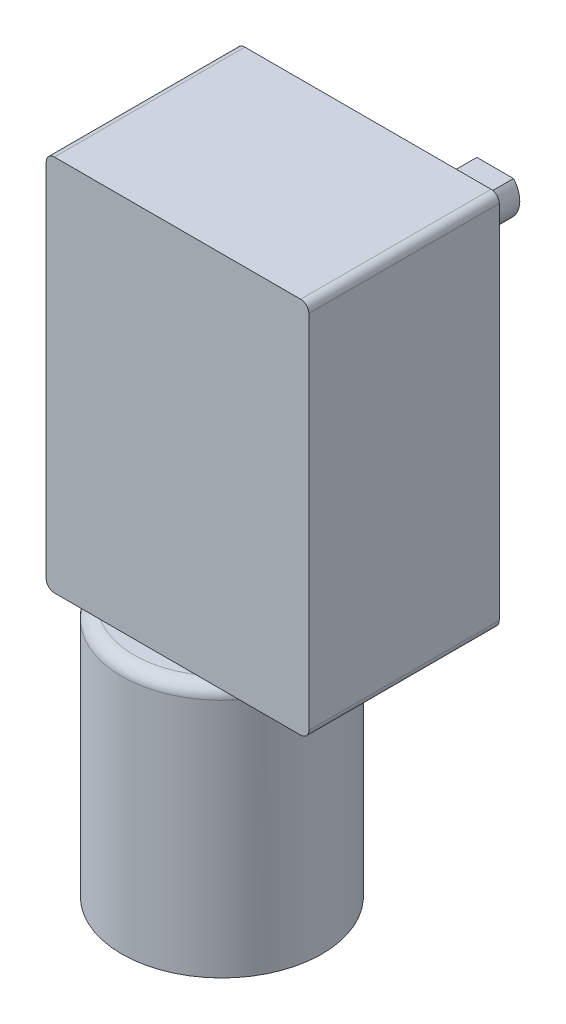
ISO-10303-21;
HEADER;
FILE_DESCRIPTION(('STEP AP214'),'2;1');
FILE_NAME('part.step','',(''),(''),'','','');
FILE_SCHEMA(('AUTOMOTIVE_DESIGN { 1 0 10303 214 1 1 1 1 }'));
ENDSEC;
DATA;
#1=APPLICATION_CONTEXT('core data for automotive mechanical design processes');
#2=APPLICATION_PROTOCOL_DEFINITION('international standard','automotive_design',2000,#1);
#3=PRODUCT_CONTEXT('',#1,'mechanical');
#4=PRODUCT('Part','Part','',(#3));
#5=PRODUCT_RELATED_PRODUCT_CATEGORY('part','',(#4));
#6=PRODUCT_DEFINITION_FORMATION('','',#4);
#7=PRODUCT_DEFINITION_CONTEXT('part definition',#1,'design');
#8=PRODUCT_DEFINITION('design','',#6,#7);
#9=PRODUCT_DEFINITION_SHAPE('','',#8);
#10=(LENGTH_UNIT() NAMED_UNIT(*) SI_UNIT(.MILLI.,.METRE.));
#11=(NAMED_UNIT(*) PLANE_ANGLE_UNIT() SI_UNIT($,.RADIAN.));
#12=(NAMED_UNIT(*) SI_UNIT($,.STERADIAN.) SOLID_ANGLE_UNIT());
#13=UNCERTAINTY_MEASURE_WITH_UNIT(LENGTH_MEASURE(1.E-05),#10,'distance_accuracy_value','');
#14=(GEOMETRIC_REPRESENTATION_CONTEXT(3) GLOBAL_UNCERTAINTY_ASSIGNED_CONTEXT((#13)) GLOBAL_UNIT_ASSIGNED_CONTEXT((#10,
#11,#12)) REPRESENTATION_CONTEXT('',''));
#15=CARTESIAN_POINT('',(0.,0.,0.));
#16=DIRECTION('',(0.,0.,1.));
#17=DIRECTION('',(1.,0.,0.));
#18=AXIS2_PLACEMENT_3D('',#15,#16,#17);
#19=CARTESIAN_POINT('',(12.2,-31.,14.));
#20=DIRECTION('',(0.,1.,0.));
#21=DIRECTION('',(0.,0.,1.));
#22=AXIS2_PLACEMENT_3D('',#19,#20,#21);
#23=CYLINDRICAL_SURFACE('',#22,12.2);
#24=CARTESIAN_POINT('',(12.2,-1.7,14.));
#25=DIRECTION('',(0.,-1.,0.));
#26=DIRECTION('',(0.,0.,-1.));
#27=AXIS2_PLACEMENT_3D('',#24,#25,#26);
#28=CIRCLE('',#27,12.2);
#29=CARTESIAN_POINT('',(12.2,-1.7,26.2));
#30=VERTEX_POINT('',#29);
#31=EDGE_CURVE('E65',#30,#30,#28,.T.);
#32=CARTESIAN_POINT('',(12.2,-31.,14.));
#33=DIRECTION('',(0.,-1.,0.));
#34=DIRECTION('',(0.,0.,-1.));
#35=AXIS2_PLACEMENT_3D('',#32,#33,#34);
#36=CIRCLE('',#35,12.2);
#37=CARTESIAN_POINT('',(12.2,-31.,26.2));
#38=VERTEX_POINT('',#37);
#39=EDGE_CURVE('E69',#38,#38,#36,.T.);
#40=CARTESIAN_POINT('',(12.2,-1.7,26.2));
#41=CARTESIAN_POINT('',(12.2,-2.00520833333333,26.2));
#42=CARTESIAN_POINT('',(12.2,-2.31041666666666,26.2));
#43=CARTESIAN_POINT('',(12.2,-2.92083333333333,26.2));
#44=CARTESIAN_POINT('',(12.2,-3.22604166666666,26.2));
#45=CARTESIAN_POINT('',(12.2,-3.83645833333333,26.2));
#46=CARTESIAN_POINT('',(12.2,-4.14166666666666,26.2));
#47=CARTESIAN_POINT('',(12.2,-4.75208333333333,26.2));
#48=CARTESIAN_POINT('',(12.2,-5.05729166666666,26.2));
#49=CARTESIAN_POINT('',(12.2,-5.66770833333333,26.2));
#50=CARTESIAN_POINT('',(12.2,-5.97291666666666,26.2));
#51=CARTESIAN_POINT('',(12.2,-6.58333333333333,26.2));
#52=CARTESIAN_POINT('',(12.2,-6.88854166666666,26.2));
#53=CARTESIAN_POINT('',(12.2,-7.49895833333333,26.2));
#54=CARTESIAN_POINT('',(12.2,-7.80416666666666,26.2));
#55=CARTESIAN_POINT('',(12.2,-8.41458333333333,26.2));
#56=CARTESIAN_POINT('',(12.2,-8.71979166666667,26.2));
#57=CARTESIAN_POINT('',(12.2,-9.33020833333333,26.2));
#58=CARTESIAN_POINT('',(12.2,-9.63541666666667,26.2));
#59=CARTESIAN_POINT('',(12.2,-10.2458333333333,26.2));
#60=CARTESIAN_POINT('',(12.2,-10.5510416666667,26.2));
#61=CARTESIAN_POINT('',(12.2,-11.1614583333333,26.2));
#62=CARTESIAN_POINT('',(12.2,-11.4666666666667,26.2));
#63=CARTESIAN_POINT('',(12.2,-12.0770833333333,26.2));
#64=CARTESIAN_POINT('',(12.2,-12.3822916666667,26.2));
#65=CARTESIAN_POINT('',(12.2,-12.9927083333333,26.2));
#66=CARTESIAN_POINT('',(12.2,-13.2979166666667,26.2));
#67=CARTESIAN_POINT('',(12.2,-13.9083333333333,26.2));
#68=CARTESIAN_POINT('',(12.2,-14.2135416666667,26.2));
#69=CARTESIAN_POINT('',(12.2,-14.8239583333333,26.2));
#70=CARTESIAN_POINT('',(12.2,-15.1291666666667,26.2));
#71=CARTESIAN_POINT('',(12.2,-15.7395833333333,26.2));
#72=CARTESIAN_POINT('',(12.2,-16.0447916666667,26.2));
#73=CARTESIAN_POINT('',(12.2,-16.6552083333333,26.2));
#74=CARTESIAN_POINT('',(12.2,-16.9604166666667,26.2));
#75=CARTESIAN_POINT('',(12.2,-17.5708333333333,26.2));
#76=CARTESIAN_POINT('',(12.2,-17.8760416666667,26.2));
#77=CARTESIAN_POINT('',(12.2,-18.4864583333333,26.2));
#78=CARTESIAN_POINT('',(12.2,-18.7916666666667,26.2));
#79=CARTESIAN_POINT('',(12.2,-19.4020833333333,26.2));
#80=CARTESIAN_POINT('',(12.2,-19.7072916666667,26.2));
#81=CARTESIAN_POINT('',(12.2,-20.3177083333333,26.2));
#82=CARTESIAN_POINT('',(12.2,-20.6229166666667,26.2));
#83=CARTESIAN_POINT('',(12.2,-21.2333333333333,26.2));
#84=CARTESIAN_POINT('',(12.2,-21.5385416666667,26.2));
#85=CARTESIAN_POINT('',(12.2,-22.1489583333333,26.2));
#86=CARTESIAN_POINT('',(12.2,-22.4541666666667,26.2));
#87=CARTESIAN_POINT('',(12.2,-23.0645833333333,26.2));
#88=CARTESIAN_POINT('',(12.2,-23.3697916666667,26.2));
#89=CARTESIAN_POINT('',(12.2,-23.9802083333333,26.2));
#90=CARTESIAN_POINT('',(12.2,-24.2854166666667,26.2));
#91=CARTESIAN_POINT('',(12.2,-24.8958333333333,26.2));
#92=CARTESIAN_POINT('',(12.2,-25.2010416666667,26.2));
#93=CARTESIAN_POINT('',(12.2,-25.8114583333333,26.2));
#94=CARTESIAN_POINT('',(12.2,-26.1166666666667,26.2));
#95=CARTESIAN_POINT('',(12.2,-26.7270833333333,26.2));
#96=CARTESIAN_POINT('',(12.2,-27.0322916666667,26.2));
#97=CARTESIAN_POINT('',(12.2,-27.6427083333333,26.2));
#98=CARTESIAN_POINT('',(12.2,-27.9479166666667,26.2));
#99=CARTESIAN_POINT('',(12.2,-28.5583333333333,26.2));
#100=CARTESIAN_POINT('',(12.2,-28.8635416666667,26.2));
#101=CARTESIAN_POINT('',(12.2,-29.4739583333333,26.2));
#102=CARTESIAN_POINT('',(12.2,-29.7791666666667,26.2));
#103=CARTESIAN_POINT('',(12.2,-30.3895833333333,26.2));
#104=CARTESIAN_POINT('',(12.2,-30.6947916666667,26.2));
#105=CARTESIAN_POINT('',(12.2,-31.,26.2));
#106=B_SPLINE_CURVE_WITH_KNOTS('',3,(#40,#41,#42,#43,#44,#45,#46,#47,#48,#49,#50,#51,#52,#53,
#54,#55,#56,#57,#58,#59,#60,#61,#62,#63,#64,#65,#66,#67,#68,#69,#70,#71,#72,#73,#74,#75,#76,#77,
#78,#79,#80,#81,#82,#83,#84,#85,#86,#87,#88,#89,#90,#91,#92,#93,#94,#95,#96,#97,#98,#99,#100,
#101,#102,#103,#104,#105),.UNSPECIFIED.,.F.,.F.,(4,2,2,2,2,2,2,2,2,2,2,2,2,2,2,2,2,2,2,2,2,2,2,
2,2,2,2,2,2,2,2,2,4),(0.,0.915625,1.83125,2.746875,3.6625,4.578125,5.49375,6.409375,7.325,
8.240625,9.15625,10.071875,10.9875,11.903125,12.81875,13.734375,14.65,15.565625,16.48125,
17.396875,18.3125,19.228125,20.14375,21.059375,21.975,22.890625,23.80625,24.721875,25.6375,
26.553125,27.46875,28.384375,29.3),.UNSPECIFIED.);
#107=EDGE_CURVE('BSEAM53',#30,#38,#106,.T.);
#108=ORIENTED_EDGE('',*,*,#31,.T.);
#109=ORIENTED_EDGE('',*,*,#39,.F.);
#110=ORIENTED_EDGE('',*,*,#107,.T.);
#111=ORIENTED_EDGE('',*,*,#107,.F.);
#112=EDGE_LOOP('',(#108,#110,#109,#111));
#113=FACE_BOUND('',#112,.T.);
#114=ADVANCED_FACE('F53',(#113),#23,.T.);
#115=CARTESIAN_POINT('',(12.2,-31.,14.));
#116=DIRECTION('',(0.,-1.,0.));
#117=DIRECTION('',(0.,0.,-1.));
#118=AXIS2_PLACEMENT_3D('',#115,#116,#117);
#119=PLANE('',#118);
#120=CARTESIAN_POINT('',(12.2,-31.,14.));
#121=DIRECTION('',(0.,-1.,0.));
#122=DIRECTION('',(0.,0.,-1.));
#123=AXIS2_PLACEMENT_3D('',#120,#121,#122);
#124=CIRCLE('',#123,3.25);
#125=CARTESIAN_POINT('',(12.2,-31.,10.75));
#126=VERTEX_POINT('',#125);
#127=EDGE_CURVE('E11',#126,#126,#124,.T.);
#128=ORIENTED_EDGE('',*,*,#127,.F.);
#129=EDGE_LOOP('',(#128));
#130=FACE_BOUND('',#129,.T.);
#131=ORIENTED_EDGE('',*,*,#39,.T.);
#132=EDGE_LOOP('',(#131));
#133=FACE_BOUND('',#132,.T.);
#134=ADVANCED_FACE('F87',(#130,#133),#119,.T.);
#135=CARTESIAN_POINT('',(12.2,-0.2,14.));
#136=DIRECTION('',(0.,-1.,0.));
#137=DIRECTION('',(0.,0.,-1.));
#138=AXIS2_PLACEMENT_3D('',#135,#136,#137);
#139=PLANE('',#138);
#140=CARTESIAN_POINT('',(12.2,-0.2,14.));
#141=DIRECTION('',(0.,-1.,0.));
#142=DIRECTION('',(0.,0.,-1.));
#143=AXIS2_PLACEMENT_3D('',#140,#141,#142);
#144=CIRCLE('',#143,10.7);
#145=CARTESIAN_POINT('',(12.2,-0.2,3.3));
#146=VERTEX_POINT('',#145);
#147=EDGE_CURVE('E57',#146,#146,#144,.F.);
#148=ORIENTED_EDGE('',*,*,#147,.T.);
#149=EDGE_LOOP('',(#148));
#150=FACE_BOUND('',#149,.T.);
#151=ADVANCED_FACE('F78',(#150),#139,.F.);
#152=CARTESIAN_POINT('',(12.2,-1.7,14.));
#153=DIRECTION('',(0.,-1.,0.));
#154=DIRECTION('',(0.,0.,-1.));
#155=AXIS2_PLACEMENT_3D('',#152,#153,#154);
#156=TOROIDAL_SURFACE('',#155,10.7,1.5);
#157=ORIENTED_EDGE('',*,*,#147,.F.);
#158=EDGE_LOOP('',(#157));
#159=FACE_BOUND('',#158,.T.);
#160=ORIENTED_EDGE('',*,*,#31,.F.);
#161=EDGE_LOOP('',(#160));
#162=FACE_BOUND('',#161,.T.);
#163=ADVANCED_FACE('F55',(#159,#162),#156,.T.);
#164=CARTESIAN_POINT('',(12.2,-33.,14.));
#165=DIRECTION('',(0.,1.,0.));
#166=DIRECTION('',(0.,0.,1.));
#167=AXIS2_PLACEMENT_3D('',#164,#165,#166);
#168=CYLINDRICAL_SURFACE('',#167,3.25);
#169=CARTESIAN_POINT('',(12.2,-33.,14.));
#170=DIRECTION('',(0.,-1.,0.));
#171=DIRECTION('',(0.,0.,-1.));
#172=AXIS2_PLACEMENT_3D('',#169,#170,#171);
#173=CIRCLE('',#172,3.25);
#174=CARTESIAN_POINT('',(12.2,-33.,10.75));
#175=VERTEX_POINT('',#174);
#176=EDGE_CURVE('E68',#175,#175,#173,.T.);
#177=ORIENTED_EDGE('',*,*,#176,.F.);
#178=EDGE_LOOP('',(#177));
#179=FACE_BOUND('',#178,.T.);
#180=ORIENTED_EDGE('',*,*,#127,.T.);
#181=EDGE_LOOP('',(#180));
#182=FACE_BOUND('',#181,.T.);
#183=ADVANCED_FACE('F77',(#179,#182),#168,.T.);
#184=CARTESIAN_POINT('',(12.2,-33.,14.));
#185=DIRECTION('',(0.,-1.,0.));
#186=DIRECTION('',(0.,0.,-1.));
#187=AXIS2_PLACEMENT_3D('',#184,#185,#186);
#188=PLANE('',#187);
#189=ORIENTED_EDGE('',*,*,#176,.T.);
#190=EDGE_LOOP('',(#189));
#191=FACE_BOUND('',#190,.T.);
#192=ADVANCED_FACE('F84',(#191),#188,.T.);
#193=CLOSED_SHELL('',(#114,#134,#151,#163,#183,#192));
#194=MANIFOLD_SOLID_BREP('B2',#193);
#195=CARTESIAN_POINT('',(0.,0.,23.2));
#196=DIRECTION('',(0.,1.,0.));
#197=DIRECTION('',(0.,0.,1.));
#198=AXIS2_PLACEMENT_3D('',#195,#196,#197);
#199=PLANE('',#198);
#200=DIRECTION('',(1.,0.,0.));
#201=VECTOR('',#200,1.);
#202=CARTESIAN_POINT('',(0.,0.,23.2));
#203=LINE('',#202,#201);
#204=CARTESIAN_POINT('',(1.,0.,23.2));
#205=VERTEX_POINT('',#204);
#206=CARTESIAN_POINT('',(31.,0.,23.2));
#207=VERTEX_POINT('',#206);
#208=EDGE_CURVE('E372',#205,#207,#203,.T.);
#209=ORIENTED_EDGE('',*,*,#208,.F.);
#210=DIRECTION('',(0.,0.,-1.));
#211=VECTOR('',#210,1.);
#212=CARTESIAN_POINT('',(1.,0.,0.));
#213=LINE('',#212,#211);
#214=CARTESIAN_POINT('',(1.,0.,0.));
#215=VERTEX_POINT('',#214);
#216=EDGE_CURVE('E447',#205,#215,#213,.T.);
#217=ORIENTED_EDGE('',*,*,#216,.T.);
#218=DIRECTION('',(1.,0.,0.));
#219=VECTOR('',#218,1.);
#220=CARTESIAN_POINT('',(0.,0.,0.));
#221=LINE('',#220,#219);
#222=CARTESIAN_POINT('',(31.,0.,0.));
#223=VERTEX_POINT('',#222);
#224=EDGE_CURVE('E368',#215,#223,#221,.T.);
#225=ORIENTED_EDGE('',*,*,#224,.T.);
#226=DIRECTION('',(0.,0.,-1.));
#227=VECTOR('',#226,1.);
#228=CARTESIAN_POINT('',(31.,0.,23.2));
#229=LINE('',#228,#227);
#230=EDGE_CURVE('E444',#223,#207,#229,.F.);
#231=ORIENTED_EDGE('',*,*,#230,.T.);
#232=EDGE_LOOP('',(#209,#217,#225,#231));
#233=FACE_BOUND('',#232,.T.);
#234=ADVANCED_FACE('F151',(#233),#199,.F.);
#235=CARTESIAN_POINT('',(32.,0.,23.2));
#236=DIRECTION('',(-1.,0.,0.));
#237=DIRECTION('',(0.,0.,1.));
#238=AXIS2_PLACEMENT_3D('',#235,#236,#237);
#239=PLANE('',#238);
#240=DIRECTION('',(0.,1.,0.));
#241=VECTOR('',#240,1.);
#242=CARTESIAN_POINT('',(32.,0.,0.));
#243=LINE('',#242,#241);
#244=CARTESIAN_POINT('',(32.,1.,0.));
#245=VERTEX_POINT('',#244);
#246=CARTESIAN_POINT('',(32.,45.,0.));
#247=VERTEX_POINT('',#246);
#248=EDGE_CURVE('E391',#245,#247,#243,.T.);
#249=ORIENTED_EDGE('',*,*,#248,.T.);
#250=DIRECTION('',(0.,0.,-1.));
#251=VECTOR('',#250,1.);
#252=CARTESIAN_POINT('',(32.,45.,23.2));
#253=LINE('',#252,#251);
#254=CARTESIAN_POINT('',(32.,45.,23.2));
#255=VERTEX_POINT('',#254);
#256=EDGE_CURVE('E51',#247,#255,#253,.F.);
#257=ORIENTED_EDGE('',*,*,#256,.T.);
#258=DIRECTION('',(0.,1.,0.));
#259=VECTOR('',#258,1.);
#260=CARTESIAN_POINT('',(32.,0.,23.2));
#261=LINE('',#260,#259);
#262=CARTESIAN_POINT('',(32.,1.,23.2));
#263=VERTEX_POINT('',#262);
#264=EDGE_CURVE('E375',#263,#255,#261,.T.);
#265=ORIENTED_EDGE('',*,*,#264,.F.);
#266=DIRECTION('',(0.,0.,-1.));
#267=VECTOR('',#266,1.);
#268=CARTESIAN_POINT('',(32.,1.,23.2));
#269=LINE('',#268,#267);
#270=EDGE_CURVE('E160',#263,#245,#269,.T.);
#271=ORIENTED_EDGE('',*,*,#270,.T.);
#272=EDGE_LOOP('',(#249,#257,#265,#271));
#273=FACE_BOUND('',#272,.T.);
#274=ADVANCED_FACE('F454',(#273),#239,.F.);
#275=CARTESIAN_POINT('',(0.,46.,23.2));
#276=DIRECTION('',(0.,1.,0.));
#277=DIRECTION('',(0.,0.,1.));
#278=AXIS2_PLACEMENT_3D('',#275,#276,#277);
#279=PLANE('',#278);
#280=DIRECTION('',(1.,0.,0.));
#281=VECTOR('',#280,1.);
#282=CARTESIAN_POINT('',(0.,46.,0.));
#283=LINE('',#282,#281);
#284=CARTESIAN_POINT('',(1.,46.,0.));
#285=VERTEX_POINT('',#284);
#286=CARTESIAN_POINT('',(31.,46.,0.));
#287=VERTEX_POINT('',#286);
#288=EDGE_CURVE('E394',#285,#287,#283,.T.);
#289=ORIENTED_EDGE('',*,*,#288,.F.);
#290=DIRECTION('',(0.,0.,-1.));
#291=VECTOR('',#290,1.);
#292=CARTESIAN_POINT('',(1.,46.,23.2));
#293=LINE('',#292,#291);
#294=CARTESIAN_POINT('',(1.,46.,23.2));
#295=VERTEX_POINT('',#294);
#296=EDGE_CURVE('E430',#285,#295,#293,.F.);
#297=ORIENTED_EDGE('',*,*,#296,.T.);
#298=DIRECTION('',(1.,0.,0.));
#299=VECTOR('',#298,1.);
#300=CARTESIAN_POINT('',(0.,46.,23.2));
#301=LINE('',#300,#299);
#302=CARTESIAN_POINT('',(31.,46.,23.2));
#303=VERTEX_POINT('',#302);
#304=EDGE_CURVE('E379',#295,#303,#301,.T.);
#305=ORIENTED_EDGE('',*,*,#304,.T.);
#306=DIRECTION('',(0.,0.,-1.));
#307=VECTOR('',#306,1.);
#308=CARTESIAN_POINT('',(31.,46.,0.));
#309=LINE('',#308,#307);
#310=EDGE_CURVE('E426',#303,#287,#309,.T.);
#311=ORIENTED_EDGE('',*,*,#310,.T.);
#312=EDGE_LOOP('',(#289,#297,#305,#311));
#313=FACE_BOUND('',#312,.T.);
#314=ADVANCED_FACE('F465',(#313),#279,.T.);
#315=CARTESIAN_POINT('',(0.,0.,23.2));
#316=DIRECTION('',(-1.,0.,0.));
#317=DIRECTION('',(0.,0.,1.));
#318=AXIS2_PLACEMENT_3D('',#315,#316,#317);
#319=PLANE('',#318);
#320=DIRECTION('',(0.,1.,0.));
#321=VECTOR('',#320,1.);
#322=CARTESIAN_POINT('',(0.,0.,23.2));
#323=LINE('',#322,#321);
#324=CARTESIAN_POINT('',(0.,1.,23.2));
#325=VERTEX_POINT('',#324);
#326=CARTESIAN_POINT('',(0.,45.,23.2));
#327=VERTEX_POINT('',#326);
#328=EDGE_CURVE('E383',#325,#327,#323,.T.);
#329=ORIENTED_EDGE('',*,*,#328,.T.);
#330=DIRECTION('',(0.,0.,-1.));
#331=VECTOR('',#330,1.);
#332=CARTESIAN_POINT('',(0.,45.,23.2));
#333=LINE('',#332,#331);
#334=CARTESIAN_POINT('',(0.,45.,0.));
#335=VERTEX_POINT('',#334);
#336=EDGE_CURVE('E410',#327,#335,#333,.T.);
#337=ORIENTED_EDGE('',*,*,#336,.T.);
#338=DIRECTION('',(0.,1.,0.));
#339=VECTOR('',#338,1.);
#340=CARTESIAN_POINT('',(0.,0.,0.));
#341=LINE('',#340,#339);
#342=CARTESIAN_POINT('',(0.,1.,0.));
#343=VERTEX_POINT('',#342);
#344=EDGE_CURVE('E376',#343,#335,#341,.T.);
#345=ORIENTED_EDGE('',*,*,#344,.F.);
#346=DIRECTION('',(0.,0.,-1.));
#347=VECTOR('',#346,1.);
#348=CARTESIAN_POINT('',(0.,1.,23.2));
#349=LINE('',#348,#347);
#350=EDGE_CURVE('E407',#343,#325,#349,.F.);
#351=ORIENTED_EDGE('',*,*,#350,.T.);
#352=EDGE_LOOP('',(#329,#337,#345,#351));
#353=FACE_BOUND('',#352,.T.);
#354=ADVANCED_FACE('F476',(#353),#319,.T.);
#355=CARTESIAN_POINT('',(0.,0.,23.2));
#356=DIRECTION('',(0.,0.,1.));
#357=DIRECTION('',(1.,0.,0.));
#358=AXIS2_PLACEMENT_3D('',#355,#356,#357);
#359=PLANE('',#358);
#360=ORIENTED_EDGE('',*,*,#304,.F.);
#361=CARTESIAN_POINT('',(1.,45.,23.2));
#362=DIRECTION('',(0.,0.,1.));
#363=DIRECTION('',(1.,0.,0.));
#364=AXIS2_PLACEMENT_3D('',#361,#362,#363);
#365=CIRCLE('',#364,1.);
#366=EDGE_CURVE('E441',#295,#327,#365,.T.);
#367=ORIENTED_EDGE('',*,*,#366,.T.);
#368=ORIENTED_EDGE('',*,*,#328,.F.);
#369=CARTESIAN_POINT('',(1.,1.,23.2));
#370=DIRECTION('',(0.,0.,1.));
#371=DIRECTION('',(1.,0.,0.));
#372=AXIS2_PLACEMENT_3D('',#369,#370,#371);
#373=CIRCLE('',#372,1.);
#374=EDGE_CURVE('E438',#325,#205,#373,.T.);
#375=ORIENTED_EDGE('',*,*,#374,.T.);
#376=ORIENTED_EDGE('',*,*,#208,.T.);
#377=CARTESIAN_POINT('',(31.,1.,23.2));
#378=DIRECTION('',(0.,0.,1.));
#379=DIRECTION('',(1.,0.,0.));
#380=AXIS2_PLACEMENT_3D('',#377,#378,#379);
#381=CIRCLE('',#380,1.);
#382=EDGE_CURVE('E172',#207,#263,#381,.T.);
#383=ORIENTED_EDGE('',*,*,#382,.T.);
#384=ORIENTED_EDGE('',*,*,#264,.T.);
#385=CARTESIAN_POINT('',(31.,45.,23.2));
#386=DIRECTION('',(0.,0.,1.));
#387=DIRECTION('',(1.,0.,0.));
#388=AXIS2_PLACEMENT_3D('',#385,#386,#387);
#389=CIRCLE('',#388,1.);
#390=EDGE_CURVE('E435',#255,#303,#389,.T.);
#391=ORIENTED_EDGE('',*,*,#390,.T.);
#392=EDGE_LOOP('',(#360,#367,#368,#375,#376,#383,#384,#391));
#393=FACE_BOUND('',#392,.T.);
#394=ADVANCED_FACE('F469',(#393),#359,.T.);
#395=CARTESIAN_POINT('',(0.,0.,0.));
#396=DIRECTION('',(0.,0.,1.));
#397=DIRECTION('',(1.,0.,0.));
#398=AXIS2_PLACEMENT_3D('',#395,#396,#397);
#399=PLANE('',#398);
#400=CARTESIAN_POINT('',(16.,31.,0.));
#401=DIRECTION('',(0.,0.,1.));
#402=DIRECTION('',(1.,0.,0.));
#403=AXIS2_PLACEMENT_3D('',#400,#401,#402);
#404=CIRCLE('',#403,7.);
#405=CARTESIAN_POINT('',(23.,31.,0.));
#406=VERTEX_POINT('',#405);
#407=EDGE_CURVE('E387',#406,#406,#404,.F.);
#408=ORIENTED_EDGE('',*,*,#407,.F.);
#409=EDGE_LOOP('',(#408));
#410=FACE_BOUND('',#409,.T.);
#411=CARTESIAN_POINT('',(25.,7.,0.));
#412=DIRECTION('',(0.,0.,1.));
#413=DIRECTION('',(1.,0.,0.));
#414=AXIS2_PLACEMENT_3D('',#411,#412,#413);
#415=CIRCLE('',#414,3.7);
#416=CARTESIAN_POINT('',(28.7,7.,0.));
#417=VERTEX_POINT('',#416);
#418=EDGE_CURVE('E339',#417,#417,#415,.T.);
#419=ORIENTED_EDGE('',*,*,#418,.T.);
#420=EDGE_LOOP('',(#419));
#421=FACE_BOUND('',#420,.T.);
#422=CARTESIAN_POINT('',(7.00000000000001,7.,0.));
#423=DIRECTION('',(0.,0.,1.));
#424=DIRECTION('',(1.,0.,0.));
#425=AXIS2_PLACEMENT_3D('',#422,#423,#424);
#426=CIRCLE('',#425,3.7);
#427=CARTESIAN_POINT('',(10.7,7.,0.));
#428=VERTEX_POINT('',#427);
#429=EDGE_CURVE('E344',#428,#428,#426,.T.);
#430=ORIENTED_EDGE('',*,*,#429,.T.);
#431=EDGE_LOOP('',(#430));
#432=FACE_BOUND('',#431,.T.);
#433=CARTESIAN_POINT('',(25.,40.,0.));
#434=DIRECTION('',(0.,0.,1.));
#435=DIRECTION('',(1.,0.,0.));
#436=AXIS2_PLACEMENT_3D('',#433,#434,#435);
#437=CIRCLE('',#436,3.7);
#438=CARTESIAN_POINT('',(28.7,40.,0.));
#439=VERTEX_POINT('',#438);
#440=EDGE_CURVE('E352',#439,#439,#437,.T.);
#441=ORIENTED_EDGE('',*,*,#440,.T.);
#442=EDGE_LOOP('',(#441));
#443=FACE_BOUND('',#442,.T.);
#444=CARTESIAN_POINT('',(7.00000000000001,40.,0.));
#445=DIRECTION('',(0.,0.,1.));
#446=DIRECTION('',(1.,0.,0.));
#447=AXIS2_PLACEMENT_3D('',#444,#445,#446);
#448=CIRCLE('',#447,3.7);
#449=CARTESIAN_POINT('',(10.7,40.,0.));
#450=VERTEX_POINT('',#449);
#451=EDGE_CURVE('E360',#450,#450,#448,.T.);
#452=ORIENTED_EDGE('',*,*,#451,.T.);
#453=EDGE_LOOP('',(#452));
#454=FACE_BOUND('',#453,.T.);
#455=ORIENTED_EDGE('',*,*,#344,.T.);
#456=CARTESIAN_POINT('',(1.,45.,0.));
#457=DIRECTION('',(0.,0.,1.));
#458=DIRECTION('',(1.,0.,0.));
#459=AXIS2_PLACEMENT_3D('',#456,#457,#458);
#460=CIRCLE('',#459,1.);
#461=EDGE_CURVE('E423',#335,#285,#460,.F.);
#462=ORIENTED_EDGE('',*,*,#461,.T.);
#463=ORIENTED_EDGE('',*,*,#288,.T.);
#464=CARTESIAN_POINT('',(31.,45.,0.));
#465=DIRECTION('',(0.,0.,1.));
#466=DIRECTION('',(1.,0.,0.));
#467=AXIS2_PLACEMENT_3D('',#464,#465,#466);
#468=CIRCLE('',#467,1.);
#469=EDGE_CURVE('E417',#287,#247,#468,.F.);
#470=ORIENTED_EDGE('',*,*,#469,.T.);
#471=ORIENTED_EDGE('',*,*,#248,.F.);
#472=CARTESIAN_POINT('',(31.,1.,0.));
#473=DIRECTION('',(0.,0.,1.));
#474=DIRECTION('',(1.,0.,0.));
#475=AXIS2_PLACEMENT_3D('',#472,#473,#474);
#476=CIRCLE('',#475,1.);
#477=EDGE_CURVE('E414',#245,#223,#476,.F.);
#478=ORIENTED_EDGE('',*,*,#477,.T.);
#479=ORIENTED_EDGE('',*,*,#224,.F.);
#480=CARTESIAN_POINT('',(1.,1.,0.));
#481=DIRECTION('',(0.,0.,1.));
#482=DIRECTION('',(1.,0.,0.));
#483=AXIS2_PLACEMENT_3D('',#480,#481,#482);
#484=CIRCLE('',#483,1.);
#485=EDGE_CURVE('E420',#215,#343,#484,.F.);
#486=ORIENTED_EDGE('',*,*,#485,.T.);
#487=EDGE_LOOP('',(#455,#462,#463,#470,#471,#478,#479,#486));
#488=FACE_BOUND('',#487,.T.);
#489=ADVANCED_FACE('F457',(#410,#421,#432,#443,#454,#488),#399,.F.);
#490=CARTESIAN_POINT('',(7.00000000000001,40.,-2.));
#491=DIRECTION('',(0.,0.,1.));
#492=DIRECTION('',(1.,0.,0.));
#493=AXIS2_PLACEMENT_3D('',#490,#491,#492);
#494=CYLINDRICAL_SURFACE('',#493,3.7);
#495=CARTESIAN_POINT('',(7.00000000000001,40.,-2.));
#496=DIRECTION('',(0.,0.,1.));
#497=DIRECTION('',(1.,0.,0.));
#498=AXIS2_PLACEMENT_3D('',#495,#496,#497);
#499=CIRCLE('',#498,3.7);
#500=CARTESIAN_POINT('',(10.7,40.,-2.));
#501=VERTEX_POINT('',#500);
#502=EDGE_CURVE('E364',#501,#501,#499,.T.);
#503=ORIENTED_EDGE('',*,*,#502,.T.);
#504=EDGE_LOOP('',(#503));
#505=FACE_BOUND('',#504,.T.);
#506=ORIENTED_EDGE('',*,*,#451,.F.);
#507=EDGE_LOOP('',(#506));
#508=FACE_BOUND('',#507,.T.);
#509=ADVANCED_FACE('F543',(#505,#508),#494,.T.);
#510=CARTESIAN_POINT('',(0.,0.,-2.));
#511=DIRECTION('',(0.,0.,1.));
#512=DIRECTION('',(1.,0.,0.));
#513=AXIS2_PLACEMENT_3D('',#510,#511,#512);
#514=PLANE('',#513);
#515=CARTESIAN_POINT('',(7.00000000000001,40.,-2.));
#516=DIRECTION('',(0.,0.,-1.));
#517=DIRECTION('',(-1.,0.,0.));
#518=AXIS2_PLACEMENT_3D('',#515,#516,#517);
#519=CIRCLE('',#518,1.525);
#520=CARTESIAN_POINT('',(5.47500000000001,40.,-2.));
#521=VERTEX_POINT('',#520);
#522=EDGE_CURVE('E327',#521,#521,#519,.T.);
#523=ORIENTED_EDGE('',*,*,#522,.F.);
#524=EDGE_LOOP('',(#523));
#525=FACE_BOUND('',#524,.T.);
#526=ORIENTED_EDGE('',*,*,#502,.F.);
#527=EDGE_LOOP('',(#526));
#528=FACE_BOUND('',#527,.T.);
#529=ADVANCED_FACE('F840',(#525,#528),#514,.F.);
#530=CARTESIAN_POINT('',(25.,40.,-2.));
#531=DIRECTION('',(0.,0.,1.));
#532=DIRECTION('',(1.,0.,0.));
#533=AXIS2_PLACEMENT_3D('',#530,#531,#532);
#534=CYLINDRICAL_SURFACE('',#533,3.7);
#535=CARTESIAN_POINT('',(25.,40.,-2.));
#536=DIRECTION('',(0.,0.,1.));
#537=DIRECTION('',(1.,0.,0.));
#538=AXIS2_PLACEMENT_3D('',#535,#536,#537);
#539=CIRCLE('',#538,3.7);
#540=CARTESIAN_POINT('',(28.7,40.,-2.));
#541=VERTEX_POINT('',#540);
#542=EDGE_CURVE('E356',#541,#541,#539,.T.);
#543=ORIENTED_EDGE('',*,*,#542,.T.);
#544=EDGE_LOOP('',(#543));
#545=FACE_BOUND('',#544,.T.);
#546=ORIENTED_EDGE('',*,*,#440,.F.);
#547=EDGE_LOOP('',(#546));
#548=FACE_BOUND('',#547,.T.);
#549=ADVANCED_FACE('F831',(#545,#548),#534,.T.);
#550=CARTESIAN_POINT('',(0.,0.,-2.));
#551=DIRECTION('',(0.,0.,1.));
#552=DIRECTION('',(1.,0.,0.));
#553=AXIS2_PLACEMENT_3D('',#550,#551,#552);
#554=PLANE('',#553);
#555=CARTESIAN_POINT('',(25.,40.,-2.));
#556=DIRECTION('',(0.,0.,-1.));
#557=DIRECTION('',(-1.,0.,0.));
#558=AXIS2_PLACEMENT_3D('',#555,#556,#557);
#559=CIRCLE('',#558,1.525);
#560=CARTESIAN_POINT('',(23.475,40.,-2.));
#561=VERTEX_POINT('',#560);
#562=EDGE_CURVE('E315',#561,#561,#559,.T.);
#563=ORIENTED_EDGE('',*,*,#562,.F.);
#564=EDGE_LOOP('',(#563));
#565=FACE_BOUND('',#564,.T.);
#566=ORIENTED_EDGE('',*,*,#542,.F.);
#567=EDGE_LOOP('',(#566));
#568=FACE_BOUND('',#567,.T.);
#569=ADVANCED_FACE('F825',(#565,#568),#554,.F.);
#570=CARTESIAN_POINT('',(7.00000000000001,7.,-2.));
#571=DIRECTION('',(0.,0.,1.));
#572=DIRECTION('',(1.,0.,0.));
#573=AXIS2_PLACEMENT_3D('',#570,#571,#572);
#574=CYLINDRICAL_SURFACE('',#573,3.7);
#575=CARTESIAN_POINT('',(7.00000000000001,7.,-2.));
#576=DIRECTION('',(0.,0.,1.));
#577=DIRECTION('',(1.,0.,0.));
#578=AXIS2_PLACEMENT_3D('',#575,#576,#577);
#579=CIRCLE('',#578,3.7);
#580=CARTESIAN_POINT('',(10.7,7.,-2.));
#581=VERTEX_POINT('',#580);
#582=EDGE_CURVE('E348',#581,#581,#579,.T.);
#583=ORIENTED_EDGE('',*,*,#582,.T.);
#584=EDGE_LOOP('',(#583));
#585=FACE_BOUND('',#584,.T.);
#586=ORIENTED_EDGE('',*,*,#429,.F.);
#587=EDGE_LOOP('',(#586));
#588=FACE_BOUND('',#587,.T.);
#589=ADVANCED_FACE('F818',(#585,#588),#574,.T.);
#590=CARTESIAN_POINT('',(0.,0.,-2.));
#591=DIRECTION('',(0.,0.,1.));
#592=DIRECTION('',(1.,0.,0.));
#593=AXIS2_PLACEMENT_3D('',#590,#591,#592);
#594=PLANE('',#593);
#595=CARTESIAN_POINT('',(7.00000000000001,7.,-2.));
#596=DIRECTION('',(0.,0.,-1.));
#597=DIRECTION('',(-1.,0.,0.));
#598=AXIS2_PLACEMENT_3D('',#595,#596,#597);
#599=CIRCLE('',#598,1.525);
#600=CARTESIAN_POINT('',(5.47500000000001,7.,-2.));
#601=VERTEX_POINT('',#600);
#602=EDGE_CURVE('E291',#601,#601,#599,.T.);
#603=ORIENTED_EDGE('',*,*,#602,.F.);
#604=EDGE_LOOP('',(#603));
#605=FACE_BOUND('',#604,.T.);
#606=ORIENTED_EDGE('',*,*,#582,.F.);
#607=EDGE_LOOP('',(#606));
#608=FACE_BOUND('',#607,.T.);
#609=ADVANCED_FACE('F813',(#605,#608),#594,.F.);
#610=CARTESIAN_POINT('',(25.,7.,-2.));
#611=DIRECTION('',(0.,0.,1.));
#612=DIRECTION('',(1.,0.,0.));
#613=AXIS2_PLACEMENT_3D('',#610,#611,#612);
#614=CYLINDRICAL_SURFACE('',#613,3.7);
#615=CARTESIAN_POINT('',(25.,7.,-2.));
#616=DIRECTION('',(0.,0.,1.));
#617=DIRECTION('',(1.,0.,0.));
#618=AXIS2_PLACEMENT_3D('',#615,#616,#617);
#619=CIRCLE('',#618,3.7);
#620=CARTESIAN_POINT('',(28.7,7.,-2.));
#621=VERTEX_POINT('',#620);
#622=EDGE_CURVE('E340',#621,#621,#619,.T.);
#623=ORIENTED_EDGE('',*,*,#622,.T.);
#624=EDGE_LOOP('',(#623));
#625=FACE_BOUND('',#624,.T.);
#626=ORIENTED_EDGE('',*,*,#418,.F.);
#627=EDGE_LOOP('',(#626));
#628=FACE_BOUND('',#627,.T.);
#629=ADVANCED_FACE('F804',(#625,#628),#614,.T.);
#630=CARTESIAN_POINT('',(0.,0.,-2.));
#631=DIRECTION('',(0.,0.,1.));
#632=DIRECTION('',(1.,0.,0.));
#633=AXIS2_PLACEMENT_3D('',#630,#631,#632);
#634=PLANE('',#633);
#635=CARTESIAN_POINT('',(25.,7.,-2.));
#636=DIRECTION('',(0.,0.,-1.));
#637=DIRECTION('',(-1.,0.,0.));
#638=AXIS2_PLACEMENT_3D('',#635,#636,#637);
#639=CIRCLE('',#638,1.525);
#640=CARTESIAN_POINT('',(23.475,7.,-2.));
#641=VERTEX_POINT('',#640);
#642=EDGE_CURVE('E303',#641,#641,#639,.T.);
#643=ORIENTED_EDGE('',*,*,#642,.F.);
#644=EDGE_LOOP('',(#643));
#645=FACE_BOUND('',#644,.T.);
#646=ORIENTED_EDGE('',*,*,#622,.F.);
#647=EDGE_LOOP('',(#646));
#648=FACE_BOUND('',#647,.T.);
#649=ADVANCED_FACE('F793',(#645,#648),#634,.F.);
#650=CARTESIAN_POINT('',(7.00000000000001,40.,5.49999999999999));
#651=DIRECTION('',(0.,0.,-1.));
#652=DIRECTION('',(-1.,0.,0.));
#653=AXIS2_PLACEMENT_3D('',#650,#651,#652);
#654=CONICAL_SURFACE('',#653,1.24999999999999,1.02974425867665);
#655=CARTESIAN_POINT('',(7.,40.,6.25107577378444));
#656=VERTEX_POINT('',#655);
#657=VERTEX_LOOP('',#656);
#658=FACE_BOUND('',#657,.T.);
#659=CARTESIAN_POINT('',(7.00000000000001,40.,5.49999999999999));
#660=DIRECTION('',(0.,0.,-1.));
#661=DIRECTION('',(-1.,0.,0.));
#662=AXIS2_PLACEMENT_3D('',#659,#660,#661);
#663=CIRCLE('',#662,1.24999999999999);
#664=CARTESIAN_POINT('',(5.75000000000002,40.,5.49999999999999));
#665=VERTEX_POINT('',#664);
#666=EDGE_CURVE('E335',#665,#665,#663,.T.);
#667=ORIENTED_EDGE('',*,*,#666,.T.);
#668=EDGE_LOOP('',(#667));
#669=FACE_BOUND('',#668,.T.);
#670=ADVANCED_FACE('F783',(#658,#669),#654,.F.);
#671=CARTESIAN_POINT('',(7.00000000000001,40.,-2.));
#672=DIRECTION('',(0.,0.,-1.));
#673=DIRECTION('',(-1.,0.,0.));
#674=AXIS2_PLACEMENT_3D('',#671,#672,#673);
#675=CYLINDRICAL_SURFACE('',#674,1.24999999999999);
#676=ORIENTED_EDGE('',*,*,#666,.F.);
#677=EDGE_LOOP('',(#676));
#678=FACE_BOUND('',#677,.T.);
#679=CARTESIAN_POINT('',(7.00000000000001,40.,-1.725));
#680=DIRECTION('',(0.,0.,-1.));
#681=DIRECTION('',(-1.,0.,0.));
#682=AXIS2_PLACEMENT_3D('',#679,#680,#681);
#683=CIRCLE('',#682,1.25);
#684=CARTESIAN_POINT('',(5.75000000000001,40.,-1.725));
#685=VERTEX_POINT('',#684);
#686=EDGE_CURVE('E331',#685,#685,#683,.T.);
#687=ORIENTED_EDGE('',*,*,#686,.T.);
#688=EDGE_LOOP('',(#687));
#689=FACE_BOUND('',#688,.T.);
#690=ADVANCED_FACE('F773',(#678,#689),#675,.F.);
#691=CARTESIAN_POINT('',(7.00000000000001,40.,-2.));
#692=DIRECTION('',(0.,0.,-1.));
#693=DIRECTION('',(-1.,0.,0.));
#694=AXIS2_PLACEMENT_3D('',#691,#692,#693);
#695=CONICAL_SURFACE('',#694,1.525,0.785398163397445);
#696=ORIENTED_EDGE('',*,*,#686,.F.);
#697=EDGE_LOOP('',(#696));
#698=FACE_BOUND('',#697,.T.);
#699=ORIENTED_EDGE('',*,*,#522,.T.);
#700=EDGE_LOOP('',(#699));
#701=FACE_BOUND('',#700,.T.);
#702=ADVANCED_FACE('F763',(#698,#701),#695,.F.);
#703=CARTESIAN_POINT('',(25.,40.,5.49999999999999));
#704=DIRECTION('',(0.,0.,-1.));
#705=DIRECTION('',(-1.,0.,0.));
#706=AXIS2_PLACEMENT_3D('',#703,#704,#705);
#707=CONICAL_SURFACE('',#706,1.24999999999999,1.02974425867665);
#708=CARTESIAN_POINT('',(25.,40.,6.25107577378444));
#709=VERTEX_POINT('',#708);
#710=VERTEX_LOOP('',#709);
#711=FACE_BOUND('',#710,.T.);
#712=CARTESIAN_POINT('',(25.,40.,5.49999999999999));
#713=DIRECTION('',(0.,0.,-1.));
#714=DIRECTION('',(-1.,0.,0.));
#715=AXIS2_PLACEMENT_3D('',#712,#713,#714);
#716=CIRCLE('',#715,1.24999999999999);
#717=CARTESIAN_POINT('',(23.75,40.,5.49999999999999));
#718=VERTEX_POINT('',#717);
#719=EDGE_CURVE('E323',#718,#718,#716,.T.);
#720=ORIENTED_EDGE('',*,*,#719,.T.);
#721=EDGE_LOOP('',(#720));
#722=FACE_BOUND('',#721,.T.);
#723=ADVANCED_FACE('F753',(#711,#722),#707,.F.);
#724=CARTESIAN_POINT('',(25.,40.,-2.));
#725=DIRECTION('',(0.,0.,-1.));
#726=DIRECTION('',(-1.,0.,0.));
#727=AXIS2_PLACEMENT_3D('',#724,#725,#726);
#728=CYLINDRICAL_SURFACE('',#727,1.24999999999999);
#729=ORIENTED_EDGE('',*,*,#719,.F.);
#730=EDGE_LOOP('',(#729));
#731=FACE_BOUND('',#730,.T.);
#732=CARTESIAN_POINT('',(25.,40.,-1.725));
#733=DIRECTION('',(0.,0.,-1.));
#734=DIRECTION('',(-1.,0.,0.));
#735=AXIS2_PLACEMENT_3D('',#732,#733,#734);
#736=CIRCLE('',#735,1.25);
#737=CARTESIAN_POINT('',(23.75,40.,-1.725));
#738=VERTEX_POINT('',#737);
#739=EDGE_CURVE('E319',#738,#738,#736,.T.);
#740=ORIENTED_EDGE('',*,*,#739,.T.);
#741=EDGE_LOOP('',(#740));
#742=FACE_BOUND('',#741,.T.);
#743=ADVANCED_FACE('F743',(#731,#742),#728,.F.);
#744=CARTESIAN_POINT('',(25.,40.,-2.));
#745=DIRECTION('',(0.,0.,-1.));
#746=DIRECTION('',(-1.,0.,0.));
#747=AXIS2_PLACEMENT_3D('',#744,#745,#746);
#748=CONICAL_SURFACE('',#747,1.525,0.785398163397451);
#749=ORIENTED_EDGE('',*,*,#739,.F.);
#750=EDGE_LOOP('',(#749));
#751=FACE_BOUND('',#750,.T.);
#752=ORIENTED_EDGE('',*,*,#562,.T.);
#753=EDGE_LOOP('',(#752));
#754=FACE_BOUND('',#753,.T.);
#755=ADVANCED_FACE('F733',(#751,#754),#748,.F.);
#756=CARTESIAN_POINT('',(25.,7.,5.49999999999999));
#757=DIRECTION('',(0.,0.,-1.));
#758=DIRECTION('',(-1.,0.,0.));
#759=AXIS2_PLACEMENT_3D('',#756,#757,#758);
#760=CONICAL_SURFACE('',#759,1.24999999999999,1.02974425867665);
#761=CARTESIAN_POINT('',(25.,7.,6.25107577378444));
#762=VERTEX_POINT('',#761);
#763=VERTEX_LOOP('',#762);
#764=FACE_BOUND('',#763,.T.);
#765=CARTESIAN_POINT('',(25.,7.,5.49999999999999));
#766=DIRECTION('',(0.,0.,-1.));
#767=DIRECTION('',(-1.,0.,0.));
#768=AXIS2_PLACEMENT_3D('',#765,#766,#767);
#769=CIRCLE('',#768,1.24999999999999);
#770=CARTESIAN_POINT('',(23.75,7.,5.49999999999999));
#771=VERTEX_POINT('',#770);
#772=EDGE_CURVE('E311',#771,#771,#769,.T.);
#773=ORIENTED_EDGE('',*,*,#772,.T.);
#774=EDGE_LOOP('',(#773));
#775=FACE_BOUND('',#774,.T.);
#776=ADVANCED_FACE('F722',(#764,#775),#760,.F.);
#777=CARTESIAN_POINT('',(25.,7.,-2.));
#778=DIRECTION('',(0.,0.,-1.));
#779=DIRECTION('',(-1.,0.,0.));
#780=AXIS2_PLACEMENT_3D('',#777,#778,#779);
#781=CYLINDRICAL_SURFACE('',#780,1.24999999999999);
#782=ORIENTED_EDGE('',*,*,#772,.F.);
#783=EDGE_LOOP('',(#782));
#784=FACE_BOUND('',#783,.T.);
#785=CARTESIAN_POINT('',(25.,7.,-1.725));
#786=DIRECTION('',(0.,0.,-1.));
#787=DIRECTION('',(-1.,0.,0.));
#788=AXIS2_PLACEMENT_3D('',#785,#786,#787);
#789=CIRCLE('',#788,1.25);
#790=CARTESIAN_POINT('',(23.75,7.,-1.725));
#791=VERTEX_POINT('',#790);
#792=EDGE_CURVE('E307',#791,#791,#789,.T.);
#793=ORIENTED_EDGE('',*,*,#792,.T.);
#794=EDGE_LOOP('',(#793));
#795=FACE_BOUND('',#794,.T.);
#796=ADVANCED_FACE('F712',(#784,#795),#781,.F.);
#797=CARTESIAN_POINT('',(25.,7.,-2.));
#798=DIRECTION('',(0.,0.,-1.));
#799=DIRECTION('',(-1.,0.,0.));
#800=AXIS2_PLACEMENT_3D('',#797,#798,#799);
#801=CONICAL_SURFACE('',#800,1.525,0.785398163397451);
#802=ORIENTED_EDGE('',*,*,#792,.F.);
#803=EDGE_LOOP('',(#802));
#804=FACE_BOUND('',#803,.T.);
#805=ORIENTED_EDGE('',*,*,#642,.T.);
#806=EDGE_LOOP('',(#805));
#807=FACE_BOUND('',#806,.T.);
#808=ADVANCED_FACE('F702',(#804,#807),#801,.F.);
#809=CARTESIAN_POINT('',(7.00000000000001,7.,5.49999999999999));
#810=DIRECTION('',(0.,0.,-1.));
#811=DIRECTION('',(-1.,0.,0.));
#812=AXIS2_PLACEMENT_3D('',#809,#810,#811);
#813=CONICAL_SURFACE('',#812,1.24999999999999,1.02974425867665);
#814=CARTESIAN_POINT('',(7.,7.,6.25107577378444));
#815=VERTEX_POINT('',#814);
#816=VERTEX_LOOP('',#815);
#817=FACE_BOUND('',#816,.T.);
#818=CARTESIAN_POINT('',(7.00000000000001,7.,5.49999999999999));
#819=DIRECTION('',(0.,0.,-1.));
#820=DIRECTION('',(-1.,0.,0.));
#821=AXIS2_PLACEMENT_3D('',#818,#819,#820);
#822=CIRCLE('',#821,1.24999999999999);
#823=CARTESIAN_POINT('',(5.75000000000002,7.,5.49999999999999));
#824=VERTEX_POINT('',#823);
#825=EDGE_CURVE('E299',#824,#824,#822,.T.);
#826=ORIENTED_EDGE('',*,*,#825,.T.);
#827=EDGE_LOOP('',(#826));
#828=FACE_BOUND('',#827,.T.);
#829=ADVANCED_FACE('F690',(#817,#828),#813,.F.);
#830=CARTESIAN_POINT('',(7.00000000000001,7.,-2.));
#831=DIRECTION('',(0.,0.,-1.));
#832=DIRECTION('',(-1.,0.,0.));
#833=AXIS2_PLACEMENT_3D('',#830,#831,#832);
#834=CYLINDRICAL_SURFACE('',#833,1.24999999999999);
#835=ORIENTED_EDGE('',*,*,#825,.F.);
#836=EDGE_LOOP('',(#835));
#837=FACE_BOUND('',#836,.T.);
#838=CARTESIAN_POINT('',(7.00000000000001,7.,-1.725));
#839=DIRECTION('',(0.,0.,-1.));
#840=DIRECTION('',(-1.,0.,0.));
#841=AXIS2_PLACEMENT_3D('',#838,#839,#840);
#842=CIRCLE('',#841,1.25);
#843=CARTESIAN_POINT('',(5.75000000000001,7.,-1.725));
#844=VERTEX_POINT('',#843);
#845=EDGE_CURVE('E295',#844,#844,#842,.T.);
#846=ORIENTED_EDGE('',*,*,#845,.T.);
#847=EDGE_LOOP('',(#846));
#848=FACE_BOUND('',#847,.T.);
#849=ADVANCED_FACE('F679',(#837,#848),#834,.F.);
#850=CARTESIAN_POINT('',(7.00000000000001,7.,-2.));
#851=DIRECTION('',(0.,0.,-1.));
#852=DIRECTION('',(-1.,0.,0.));
#853=AXIS2_PLACEMENT_3D('',#850,#851,#852);
#854=CONICAL_SURFACE('',#853,1.525,0.785398163397445);
#855=ORIENTED_EDGE('',*,*,#845,.F.);
#856=EDGE_LOOP('',(#855));
#857=FACE_BOUND('',#856,.T.);
#858=ORIENTED_EDGE('',*,*,#602,.T.);
#859=EDGE_LOOP('',(#858));
#860=FACE_BOUND('',#859,.T.);
#861=ADVANCED_FACE('F669',(#857,#860),#854,.F.);
#862=CARTESIAN_POINT('',(16.,31.,-2.));
#863=DIRECTION('',(0.,0.,1.));
#864=DIRECTION('',(1.,0.,0.));
#865=AXIS2_PLACEMENT_3D('',#862,#863,#864);
#866=CYLINDRICAL_SURFACE('',#865,7.);
#867=CARTESIAN_POINT('',(16.,31.,-2.));
#868=DIRECTION('',(0.,0.,-1.));
#869=DIRECTION('',(-1.,0.,0.));
#870=AXIS2_PLACEMENT_3D('',#867,#868,#869);
#871=CIRCLE('',#870,7.);
#872=CARTESIAN_POINT('',(9.,31.,-2.));
#873=VERTEX_POINT('',#872);
#874=EDGE_CURVE('E284',#873,#873,#871,.T.);
#875=ORIENTED_EDGE('',*,*,#874,.F.);
#876=EDGE_LOOP('',(#875));
#877=FACE_BOUND('',#876,.T.);
#878=ORIENTED_EDGE('',*,*,#407,.T.);
#879=EDGE_LOOP('',(#878));
#880=FACE_BOUND('',#879,.T.);
#881=ADVANCED_FACE('F659',(#877,#880),#866,.T.);
#882=CARTESIAN_POINT('',(16.,31.,-2.));
#883=DIRECTION('',(0.,0.,-1.));
#884=DIRECTION('',(-1.,0.,0.));
#885=AXIS2_PLACEMENT_3D('',#882,#883,#884);
#886=PLANE('',#885);
#887=CARTESIAN_POINT('',(16.,31.,-2.));
#888=DIRECTION('',(0.,0.,-1.));
#889=DIRECTION('',(-1.,0.,0.));
#890=AXIS2_PLACEMENT_3D('',#887,#888,#889);
#891=CIRCLE('',#890,3.);
#892=CARTESIAN_POINT('',(13.,31.,-2.));
#893=VERTEX_POINT('',#892);
#894=EDGE_CURVE('E288',#893,#893,#891,.T.);
#895=ORIENTED_EDGE('',*,*,#894,.F.);
#896=EDGE_LOOP('',(#895));
#897=FACE_BOUND('',#896,.T.);
#898=ORIENTED_EDGE('',*,*,#874,.T.);
#899=EDGE_LOOP('',(#898));
#900=FACE_BOUND('',#899,.T.);
#901=ADVANCED_FACE('F619',(#897,#900),#886,.T.);
#902=CARTESIAN_POINT('',(16.,31.,-15.5));
#903=DIRECTION('',(0.,0.,-1.));
#904=DIRECTION('',(-1.,0.,0.));
#905=AXIS2_PLACEMENT_3D('',#902,#903,#904);
#906=PLANE('',#905);
#907=DIRECTION('',(-1.,0.,0.));
#908=VECTOR('',#907,1.);
#909=CARTESIAN_POINT('',(18.2360679774998,33.,-15.5));
#910=LINE('',#909,#908);
#911=CARTESIAN_POINT('',(18.2360679774998,33.,-15.5));
#912=VERTEX_POINT('',#911);
#913=CARTESIAN_POINT('',(13.7639320225002,33.,-15.5));
#914=VERTEX_POINT('',#913);
#915=EDGE_CURVE('E252',#912,#914,#910,.T.);
#916=ORIENTED_EDGE('',*,*,#915,.F.);
#917=CARTESIAN_POINT('',(16.,31.,-15.5));
#918=DIRECTION('',(0.,0.,-1.));
#919=DIRECTION('',(-1.,0.,0.));
#920=AXIS2_PLACEMENT_3D('',#917,#918,#919);
#921=CIRCLE('',#920,3.);
#922=EDGE_CURVE('E265',#912,#914,#921,.T.);
#923=ORIENTED_EDGE('',*,*,#922,.T.);
#924=EDGE_LOOP('',(#916,#923));
#925=FACE_BOUND('',#924,.T.);
#926=CARTESIAN_POINT('',(16.,31.,-15.5));
#927=DIRECTION('',(0.,0.,-1.));
#928=DIRECTION('',(-1.,0.,0.));
#929=AXIS2_PLACEMENT_3D('',#926,#927,#928);
#930=CIRCLE('',#929,1.525);
#931=CARTESIAN_POINT('',(14.475,31.,-15.5));
#932=VERTEX_POINT('',#931);
#933=EDGE_CURVE('E269',#932,#932,#930,.T.);
#934=ORIENTED_EDGE('',*,*,#933,.F.);
#935=EDGE_LOOP('',(#934));
#936=FACE_BOUND('',#935,.T.);
#937=ADVANCED_FACE('F610',(#925,#936),#906,.T.);
#938=CARTESIAN_POINT('',(16.,31.,-15.5));
#939=DIRECTION('',(0.,0.,1.));
#940=DIRECTION('',(1.,0.,0.));
#941=AXIS2_PLACEMENT_3D('',#938,#939,#940);
#942=CYLINDRICAL_SURFACE('',#941,3.);
#943=ORIENTED_EDGE('',*,*,#922,.F.);
#944=DIRECTION('',(0.,0.,-1.));
#945=VECTOR('',#944,1.);
#946=CARTESIAN_POINT('',(18.2360679774998,33.,-3.5));
#947=LINE('',#946,#945);
#948=CARTESIAN_POINT('',(18.2360679774998,33.,-3.5));
#949=VERTEX_POINT('',#948);
#950=EDGE_CURVE('E256',#949,#912,#947,.T.);
#951=ORIENTED_EDGE('',*,*,#950,.F.);
#952=CARTESIAN_POINT('',(16.,31.,-3.5));
#953=DIRECTION('',(0.,0.,-1.));
#954=DIRECTION('',(-1.,0.,0.));
#955=AXIS2_PLACEMENT_3D('',#952,#953,#954);
#956=CIRCLE('',#955,3.);
#957=CARTESIAN_POINT('',(13.7639320225002,33.,-3.5));
#958=VERTEX_POINT('',#957);
#959=EDGE_CURVE('E243',#958,#949,#956,.T.);
#960=ORIENTED_EDGE('',*,*,#959,.F.);
#961=DIRECTION('',(0.,0.,-1.));
#962=VECTOR('',#961,1.);
#963=CARTESIAN_POINT('',(13.7639320225002,33.,-3.5));
#964=LINE('',#963,#962);
#965=EDGE_CURVE('E258',#958,#914,#964,.T.);
#966=ORIENTED_EDGE('',*,*,#965,.T.);
#967=EDGE_LOOP('',(#943,#951,#960,#966));
#968=FACE_BOUND('',#967,.T.);
#969=ORIENTED_EDGE('',*,*,#894,.T.);
#970=EDGE_LOOP('',(#969));
#971=FACE_BOUND('',#970,.T.);
#972=ADVANCED_FACE('F262',(#968,#971),#942,.T.);
#973=CARTESIAN_POINT('',(16.,31.,-1.5));
#974=DIRECTION('',(0.,0.,-1.));
#975=DIRECTION('',(-1.,0.,0.));
#976=AXIS2_PLACEMENT_3D('',#973,#974,#975);
#977=CONICAL_SURFACE('',#976,1.25,1.02974425867665);
#978=CARTESIAN_POINT('',(16.,31.,-0.748924226215548));
#979=VERTEX_POINT('',#978);
#980=VERTEX_LOOP('',#979);
#981=FACE_BOUND('',#980,.T.);
#982=CARTESIAN_POINT('',(16.,31.,-1.5));
#983=DIRECTION('',(0.,0.,-1.));
#984=DIRECTION('',(-1.,0.,0.));
#985=AXIS2_PLACEMENT_3D('',#982,#983,#984);
#986=CIRCLE('',#985,1.25);
#987=CARTESIAN_POINT('',(14.75,31.,-1.5));
#988=VERTEX_POINT('',#987);
#989=EDGE_CURVE('E280',#988,#988,#986,.T.);
#990=ORIENTED_EDGE('',*,*,#989,.T.);
#991=EDGE_LOOP('',(#990));
#992=FACE_BOUND('',#991,.T.);
#993=ADVANCED_FACE('F609',(#981,#992),#977,.F.);
#994=CARTESIAN_POINT('',(16.,31.,-15.5));
#995=DIRECTION('',(0.,0.,-1.));
#996=DIRECTION('',(-1.,0.,0.));
#997=AXIS2_PLACEMENT_3D('',#994,#995,#996);
#998=CYLINDRICAL_SURFACE('',#997,1.24999999999999);
#999=ORIENTED_EDGE('',*,*,#989,.F.);
#1000=EDGE_LOOP('',(#999));
#1001=FACE_BOUND('',#1000,.T.);
#1002=CARTESIAN_POINT('',(16.,31.,-15.225));
#1003=DIRECTION('',(0.,0.,-1.));
#1004=DIRECTION('',(-1.,0.,0.));
#1005=AXIS2_PLACEMENT_3D('',#1002,#1003,#1004);
#1006=CIRCLE('',#1005,1.24999999999999);
#1007=CARTESIAN_POINT('',(14.75,31.,-15.225));
#1008=VERTEX_POINT('',#1007);
#1009=EDGE_CURVE('E276',#1008,#1008,#1006,.T.);
#1010=ORIENTED_EDGE('',*,*,#1009,.T.);
#1011=EDGE_LOOP('',(#1010));
#1012=FACE_BOUND('',#1011,.T.);
#1013=ADVANCED_FACE('F630',(#1001,#1012),#998,.F.);
#1014=CARTESIAN_POINT('',(16.,31.,-15.5));
#1015=DIRECTION('',(0.,0.,-1.));
#1016=DIRECTION('',(-1.,0.,0.));
#1017=AXIS2_PLACEMENT_3D('',#1014,#1015,#1016);
#1018=CONICAL_SURFACE('',#1017,1.525,0.78539816339747);
#1019=ORIENTED_EDGE('',*,*,#1009,.F.);
#1020=EDGE_LOOP('',(#1019));
#1021=FACE_BOUND('',#1020,.T.);
#1022=ORIENTED_EDGE('',*,*,#933,.T.);
#1023=EDGE_LOOP('',(#1022));
#1024=FACE_BOUND('',#1023,.T.);
#1025=ADVANCED_FACE('F599',(#1021,#1024),#1018,.F.);
#1026=CARTESIAN_POINT('',(18.2360679774998,33.,-3.5));
#1027=DIRECTION('',(0.,-1.,0.));
#1028=DIRECTION('',(0.,0.,-1.));
#1029=AXIS2_PLACEMENT_3D('',#1026,#1027,#1028);
#1030=PLANE('',#1029);
#1031=ORIENTED_EDGE('',*,*,#915,.T.);
#1032=ORIENTED_EDGE('',*,*,#965,.F.);
#1033=DIRECTION('',(-1.,0.,0.));
#1034=VECTOR('',#1033,1.);
#1035=CARTESIAN_POINT('',(18.2360679774998,33.,-3.5));
#1036=LINE('',#1035,#1034);
#1037=EDGE_CURVE('E246',#949,#958,#1036,.T.);
#1038=ORIENTED_EDGE('',*,*,#1037,.F.);
#1039=ORIENTED_EDGE('',*,*,#950,.T.);
#1040=EDGE_LOOP('',(#1031,#1032,#1038,#1039));
#1041=FACE_BOUND('',#1040,.T.);
#1042=ADVANCED_FACE('F255',(#1041),#1030,.F.);
#1043=CARTESIAN_POINT('',(16.,31.,-3.5));
#1044=DIRECTION('',(0.,0.,-1.));
#1045=DIRECTION('',(-1.,0.,0.));
#1046=AXIS2_PLACEMENT_3D('',#1043,#1044,#1045);
#1047=PLANE('',#1046);
#1048=ORIENTED_EDGE('',*,*,#959,.T.);
#1049=ORIENTED_EDGE('',*,*,#1037,.T.);
#1050=EDGE_LOOP('',(#1048,#1049));
#1051=FACE_BOUND('',#1050,.T.);
#1052=ADVANCED_FACE('F245',(#1051),#1047,.T.);
#1053=CARTESIAN_POINT('',(1.,45.,23.2));
#1054=DIRECTION('',(0.,0.,-1.));
#1055=DIRECTION('',(-1.,0.,0.));
#1056=AXIS2_PLACEMENT_3D('',#1053,#1054,#1055);
#1057=CYLINDRICAL_SURFACE('',#1056,1.);
#1058=ORIENTED_EDGE('',*,*,#366,.F.);
#1059=ORIENTED_EDGE('',*,*,#296,.F.);
#1060=ORIENTED_EDGE('',*,*,#461,.F.);
#1061=ORIENTED_EDGE('',*,*,#336,.F.);
#1062=EDGE_LOOP('',(#1058,#1059,#1060,#1061));
#1063=FACE_BOUND('',#1062,.T.);
#1064=ADVANCED_FACE('F473',(#1063),#1057,.T.);
#1065=CARTESIAN_POINT('',(1.,1.,23.2));
#1066=DIRECTION('',(0.,0.,1.));
#1067=DIRECTION('',(1.,0.,0.));
#1068=AXIS2_PLACEMENT_3D('',#1065,#1066,#1067);
#1069=CYLINDRICAL_SURFACE('',#1068,1.);
#1070=ORIENTED_EDGE('',*,*,#374,.F.);
#1071=ORIENTED_EDGE('',*,*,#350,.F.);
#1072=ORIENTED_EDGE('',*,*,#485,.F.);
#1073=ORIENTED_EDGE('',*,*,#216,.F.);
#1074=EDGE_LOOP('',(#1070,#1071,#1072,#1073));
#1075=FACE_BOUND('',#1074,.T.);
#1076=ADVANCED_FACE('F481',(#1075),#1069,.T.);
#1077=CARTESIAN_POINT('',(31.,45.,23.2));
#1078=DIRECTION('',(0.,0.,1.));
#1079=DIRECTION('',(1.,0.,0.));
#1080=AXIS2_PLACEMENT_3D('',#1077,#1078,#1079);
#1081=CYLINDRICAL_SURFACE('',#1080,1.);
#1082=ORIENTED_EDGE('',*,*,#390,.F.);
#1083=ORIENTED_EDGE('',*,*,#256,.F.);
#1084=ORIENTED_EDGE('',*,*,#469,.F.);
#1085=ORIENTED_EDGE('',*,*,#310,.F.);
#1086=EDGE_LOOP('',(#1082,#1083,#1084,#1085));
#1087=FACE_BOUND('',#1086,.T.);
#1088=ADVANCED_FACE('F463',(#1087),#1081,.T.);
#1089=CARTESIAN_POINT('',(31.,1.,23.2));
#1090=DIRECTION('',(0.,0.,-1.));
#1091=DIRECTION('',(-1.,0.,0.));
#1092=AXIS2_PLACEMENT_3D('',#1089,#1090,#1091);
#1093=CYLINDRICAL_SURFACE('',#1092,1.);
#1094=ORIENTED_EDGE('',*,*,#382,.F.);
#1095=ORIENTED_EDGE('',*,*,#230,.F.);
#1096=ORIENTED_EDGE('',*,*,#477,.F.);
#1097=ORIENTED_EDGE('',*,*,#270,.F.);
#1098=EDGE_LOOP('',(#1094,#1095,#1096,#1097));
#1099=FACE_BOUND('',#1098,.T.);
#1100=ADVANCED_FACE('F153',(#1099),#1093,.T.);
#1101=CLOSED_SHELL('',(#234,#274,#314,#354,#394,#489,#509,#529,#549,#569,#589,#609,#629,#649,
#670,#690,#702,#723,#743,#755,#776,#796,#808,#829,#849,#861,#881,#901,#937,#972,#993,#1013,
#1025,#1042,#1052,#1064,#1076,#1088,#1100));
#1102=MANIFOLD_SOLID_BREP('B6',#1101);
#1103=ADVANCED_BREP_SHAPE_REPRESENTATION('',(#18,#194,#1102),#14);
#1104=SHAPE_DEFINITION_REPRESENTATION(#9,#1103);
ENDSEC;
END-ISO-10303-21;
